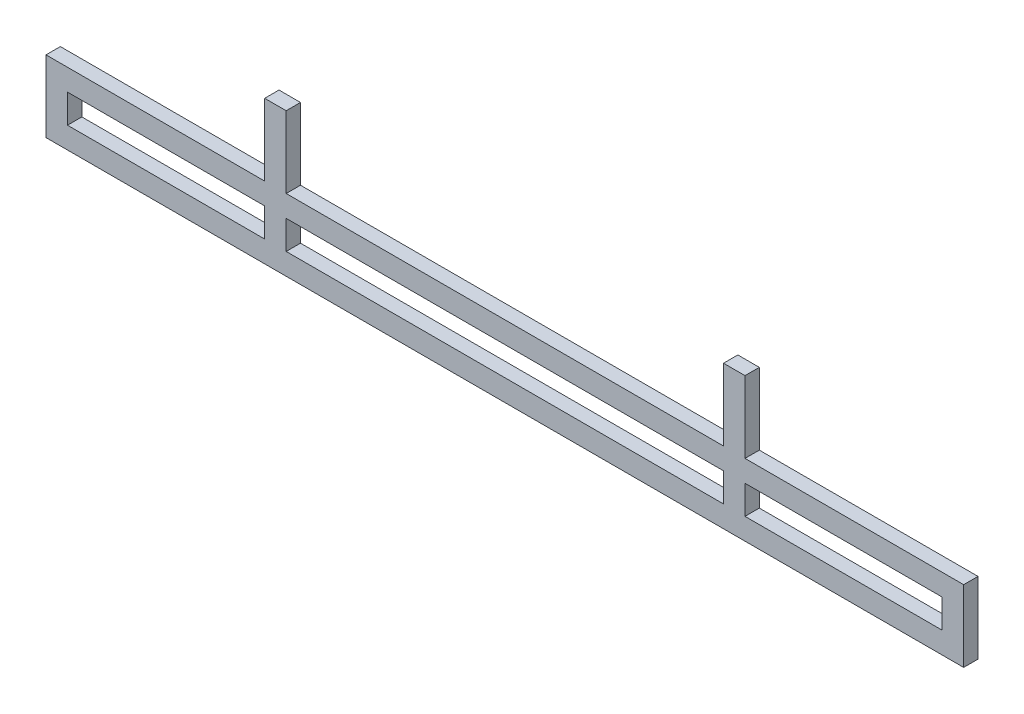
ISO-10303-21;
HEADER;
FILE_DESCRIPTION(('STEP AP214'),'2;1');
FILE_NAME('part.step','',(''),(''),'','','');
FILE_SCHEMA(('AUTOMOTIVE_DESIGN { 1 0 10303 214 1 1 1 1 }'));
ENDSEC;
DATA;
#1=APPLICATION_CONTEXT('core data for automotive mechanical design processes');
#2=APPLICATION_PROTOCOL_DEFINITION('international standard','automotive_design',2000,#1);
#3=PRODUCT_CONTEXT('',#1,'mechanical');
#4=PRODUCT('Part','Part','',(#3));
#5=PRODUCT_RELATED_PRODUCT_CATEGORY('part','',(#4));
#6=PRODUCT_DEFINITION_FORMATION('','',#4);
#7=PRODUCT_DEFINITION_CONTEXT('part definition',#1,'design');
#8=PRODUCT_DEFINITION('design','',#6,#7);
#9=PRODUCT_DEFINITION_SHAPE('','',#8);
#10=(LENGTH_UNIT() NAMED_UNIT(*) SI_UNIT(.MILLI.,.METRE.));
#11=(NAMED_UNIT(*) PLANE_ANGLE_UNIT() SI_UNIT($,.RADIAN.));
#12=(NAMED_UNIT(*) SI_UNIT($,.STERADIAN.) SOLID_ANGLE_UNIT());
#13=UNCERTAINTY_MEASURE_WITH_UNIT(LENGTH_MEASURE(1.E-05),#10,'distance_accuracy_value','');
#14=(GEOMETRIC_REPRESENTATION_CONTEXT(3) GLOBAL_UNCERTAINTY_ASSIGNED_CONTEXT((#13)) GLOBAL_UNIT_ASSIGNED_CONTEXT((#10,
#11,#12)) REPRESENTATION_CONTEXT('',''));
#15=CARTESIAN_POINT('',(0.,0.,0.));
#16=DIRECTION('',(0.,0.,1.));
#17=DIRECTION('',(1.,0.,0.));
#18=AXIS2_PLACEMENT_3D('',#15,#16,#17);
#19=CARTESIAN_POINT('',(-625.,-130.36,10.));
#20=DIRECTION('',(0.,1.,0.));
#21=DIRECTION('',(-1.,0.,0.));
#22=AXIS2_PLACEMENT_3D('',#19,#20,#21);
#23=PLANE('',#22);
#24=DIRECTION('',(0.,0.,1.));
#25=VECTOR('',#24,1.);
#26=CARTESIAN_POINT('',(-152.5,-130.36,0.));
#27=LINE('',#26,#25);
#28=CARTESIAN_POINT('',(-152.5,-130.36,0.));
#29=VERTEX_POINT('',#28);
#30=CARTESIAN_POINT('',(-152.5,-130.36,10.));
#31=VERTEX_POINT('',#30);
#32=EDGE_CURVE('E217',#29,#31,#27,.T.);
#33=ORIENTED_EDGE('',*,*,#32,.T.);
#34=DIRECTION('',(1.,0.,0.));
#35=VECTOR('',#34,1.);
#36=CARTESIAN_POINT('',(-625.,-130.36,10.));
#37=LINE('',#36,#35);
#38=CARTESIAN_POINT('',(-15.,-130.36,10.));
#39=VERTEX_POINT('',#38);
#40=EDGE_CURVE('E258',#31,#39,#37,.T.);
#41=ORIENTED_EDGE('',*,*,#40,.T.);
#42=DIRECTION('',(0.,0.,-1.));
#43=VECTOR('',#42,1.);
#44=CARTESIAN_POINT('',(-15.,-130.36,10.));
#45=LINE('',#44,#43);
#46=CARTESIAN_POINT('',(-15.,-130.36,0.));
#47=VERTEX_POINT('',#46);
#48=EDGE_CURVE('E283',#39,#47,#45,.T.);
#49=ORIENTED_EDGE('',*,*,#48,.T.);
#50=DIRECTION('',(1.,0.,0.));
#51=VECTOR('',#50,1.);
#52=CARTESIAN_POINT('',(-625.,-130.36,0.));
#53=LINE('',#52,#51);
#54=EDGE_CURVE('E245',#29,#47,#53,.T.);
#55=ORIENTED_EDGE('',*,*,#54,.F.);
#56=EDGE_LOOP('',(#33,#41,#49,#55));
#57=FACE_BOUND('',#56,.T.);
#58=ADVANCED_FACE('F35',(#57),#23,.T.);
#59=CARTESIAN_POINT('',(-625.,-110.36,10.));
#60=DIRECTION('',(0.,1.,0.));
#61=DIRECTION('',(-1.,0.,0.));
#62=AXIS2_PLACEMENT_3D('',#59,#60,#61);
#63=PLANE('',#62);
#64=DIRECTION('',(1.,0.,0.));
#65=VECTOR('',#64,1.);
#66=CARTESIAN_POINT('',(-625.,-110.36,10.));
#67=LINE('',#66,#65);
#68=CARTESIAN_POINT('',(-152.5,-110.36,10.));
#69=VERTEX_POINT('',#68);
#70=CARTESIAN_POINT('',(-15.,-110.36,10.));
#71=VERTEX_POINT('',#70);
#72=EDGE_CURVE('E50',#69,#71,#67,.T.);
#73=ORIENTED_EDGE('',*,*,#72,.F.);
#74=DIRECTION('',(0.,0.,1.));
#75=VECTOR('',#74,1.);
#76=CARTESIAN_POINT('',(-152.5,-110.36,0.));
#77=LINE('',#76,#75);
#78=CARTESIAN_POINT('',(-152.5,-110.36,0.));
#79=VERTEX_POINT('',#78);
#80=EDGE_CURVE('E209',#79,#69,#77,.T.);
#81=ORIENTED_EDGE('',*,*,#80,.F.);
#82=DIRECTION('',(1.,0.,0.));
#83=VECTOR('',#82,1.);
#84=CARTESIAN_POINT('',(-625.,-110.36,0.));
#85=LINE('',#84,#83);
#86=CARTESIAN_POINT('',(-15.,-110.36,0.));
#87=VERTEX_POINT('',#86);
#88=EDGE_CURVE('E197',#79,#87,#85,.T.);
#89=ORIENTED_EDGE('',*,*,#88,.T.);
#90=DIRECTION('',(0.,0.,-1.));
#91=VECTOR('',#90,1.);
#92=CARTESIAN_POINT('',(-15.,-110.36,10.));
#93=LINE('',#92,#91);
#94=EDGE_CURVE('E281',#71,#87,#93,.T.);
#95=ORIENTED_EDGE('',*,*,#94,.F.);
#96=EDGE_LOOP('',(#73,#81,#89,#95));
#97=FACE_BOUND('',#96,.T.);
#98=ADVANCED_FACE('F210',(#97),#63,.F.);
#99=DIRECTION('',(0.,0.,1.));
#100=VECTOR('',#99,1.);
#101=CARTESIAN_POINT('',(-167.5,-130.36,0.));
#102=LINE('',#101,#100);
#103=CARTESIAN_POINT('',(-167.5,-130.36,0.));
#104=VERTEX_POINT('',#103);
#105=CARTESIAN_POINT('',(-167.5,-130.36,10.));
#106=VERTEX_POINT('',#105);
#107=EDGE_CURVE('E229',#104,#106,#102,.T.);
#108=ORIENTED_EDGE('',*,*,#107,.F.);
#109=CARTESIAN_POINT('',(-472.5,-130.36,0.));
#110=VERTEX_POINT('',#109);
#111=EDGE_CURVE('E271',#110,#104,#53,.T.);
#112=ORIENTED_EDGE('',*,*,#111,.F.);
#113=DIRECTION('',(0.,0.,1.));
#114=VECTOR('',#113,1.);
#115=CARTESIAN_POINT('',(-472.5,-130.36,0.));
#116=LINE('',#115,#114);
#117=CARTESIAN_POINT('',(-472.5,-130.36,10.));
#118=VERTEX_POINT('',#117);
#119=EDGE_CURVE('E242',#110,#118,#116,.T.);
#120=ORIENTED_EDGE('',*,*,#119,.T.);
#121=EDGE_CURVE('E257',#118,#106,#37,.T.);
#122=ORIENTED_EDGE('',*,*,#121,.T.);
#123=EDGE_LOOP('',(#108,#112,#120,#122));
#124=FACE_BOUND('',#123,.T.);
#125=ADVANCED_FACE('F434',(#124),#23,.T.);
#126=CARTESIAN_POINT('',(-472.5,-110.36,0.));
#127=VERTEX_POINT('',#126);
#128=CARTESIAN_POINT('',(-167.5,-110.36,0.));
#129=VERTEX_POINT('',#128);
#130=EDGE_CURVE('E206',#127,#129,#85,.T.);
#131=ORIENTED_EDGE('',*,*,#130,.T.);
#132=DIRECTION('',(0.,0.,1.));
#133=VECTOR('',#132,1.);
#134=CARTESIAN_POINT('',(-167.5,-110.36,0.));
#135=LINE('',#134,#133);
#136=CARTESIAN_POINT('',(-167.5,-110.36,10.));
#137=VERTEX_POINT('',#136);
#138=EDGE_CURVE('E58',#129,#137,#135,.T.);
#139=ORIENTED_EDGE('',*,*,#138,.T.);
#140=CARTESIAN_POINT('',(-472.5,-110.36,10.));
#141=VERTEX_POINT('',#140);
#142=EDGE_CURVE('E265',#141,#137,#67,.T.);
#143=ORIENTED_EDGE('',*,*,#142,.F.);
#144=DIRECTION('',(0.,0.,1.));
#145=VECTOR('',#144,1.);
#146=CARTESIAN_POINT('',(-472.5,-110.36,0.));
#147=LINE('',#146,#145);
#148=EDGE_CURVE('E238',#127,#141,#147,.T.);
#149=ORIENTED_EDGE('',*,*,#148,.F.);
#150=EDGE_LOOP('',(#131,#139,#143,#149));
#151=FACE_BOUND('',#150,.T.);
#152=ADVANCED_FACE('F441',(#151),#63,.F.);
#153=CARTESIAN_POINT('',(0.,0.,10.));
#154=DIRECTION('',(0.,0.,1.));
#155=DIRECTION('',(1.,0.,0.));
#156=AXIS2_PLACEMENT_3D('',#153,#154,#155);
#157=PLANE('',#156);
#158=ORIENTED_EDGE('',*,*,#40,.F.);
#159=DIRECTION('',(0.,1.,0.));
#160=VECTOR('',#159,1.);
#161=CARTESIAN_POINT('',(-152.5,-110.36,10.));
#162=LINE('',#161,#160);
#163=EDGE_CURVE('E223',#31,#69,#162,.T.);
#164=ORIENTED_EDGE('',*,*,#163,.T.);
#165=ORIENTED_EDGE('',*,*,#72,.T.);
#166=DIRECTION('',(0.,-1.,0.));
#167=VECTOR('',#166,1.);
#168=CARTESIAN_POINT('',(-15.,-110.36,10.));
#169=LINE('',#168,#167);
#170=EDGE_CURVE('E256',#71,#39,#169,.T.);
#171=ORIENTED_EDGE('',*,*,#170,.T.);
#172=EDGE_LOOP('',(#158,#164,#165,#171));
#173=FACE_BOUND('',#172,.T.);
#174=ORIENTED_EDGE('',*,*,#121,.F.);
#175=DIRECTION('',(0.,1.,0.));
#176=VECTOR('',#175,1.);
#177=CARTESIAN_POINT('',(-472.5,-110.36,10.));
#178=LINE('',#177,#176);
#179=EDGE_CURVE('E228',#118,#141,#178,.T.);
#180=ORIENTED_EDGE('',*,*,#179,.T.);
#181=ORIENTED_EDGE('',*,*,#142,.T.);
#182=DIRECTION('',(0.,-1.,0.));
#183=VECTOR('',#182,1.);
#184=CARTESIAN_POINT('',(-167.5,-110.36,10.));
#185=LINE('',#184,#183);
#186=EDGE_CURVE('E219',#137,#106,#185,.T.);
#187=ORIENTED_EDGE('',*,*,#186,.T.);
#188=EDGE_LOOP('',(#174,#180,#181,#187));
#189=FACE_BOUND('',#188,.T.);
#190=DIRECTION('',(0.,1.,0.));
#191=VECTOR('',#190,1.);
#192=CARTESIAN_POINT('',(0.,-145.36,10.));
#193=LINE('',#192,#191);
#194=CARTESIAN_POINT('',(0.,-145.36,10.));
#195=VERTEX_POINT('',#194);
#196=CARTESIAN_POINT('',(0.,-95.3599999999997,10.));
#197=VERTEX_POINT('',#196);
#198=EDGE_CURVE('E339',#195,#197,#193,.T.);
#199=ORIENTED_EDGE('',*,*,#198,.T.);
#200=DIRECTION('',(-1.,0.,0.));
#201=VECTOR('',#200,1.);
#202=CARTESIAN_POINT('',(0.,-95.3599999999997,10.));
#203=LINE('',#202,#201);
#204=CARTESIAN_POINT('',(-152.5,-95.3599999999997,10.));
#205=VERTEX_POINT('',#204);
#206=EDGE_CURVE('E344',#197,#205,#203,.T.);
#207=ORIENTED_EDGE('',*,*,#206,.T.);
#208=DIRECTION('',(0.,1.,0.));
#209=VECTOR('',#208,1.);
#210=CARTESIAN_POINT('',(-152.5,0.,10.));
#211=LINE('',#210,#209);
#212=CARTESIAN_POINT('',(-152.5,-45.3599999999996,10.));
#213=VERTEX_POINT('',#212);
#214=EDGE_CURVE('E316',#205,#213,#211,.T.);
#215=ORIENTED_EDGE('',*,*,#214,.T.);
#216=DIRECTION('',(-1.,0.,0.));
#217=VECTOR('',#216,1.);
#218=CARTESIAN_POINT('',(0.,-45.3599999999996,10.));
#219=LINE('',#218,#217);
#220=CARTESIAN_POINT('',(-167.5,-45.3599999999996,10.));
#221=VERTEX_POINT('',#220);
#222=EDGE_CURVE('E314',#213,#221,#219,.T.);
#223=ORIENTED_EDGE('',*,*,#222,.T.);
#224=DIRECTION('',(0.,1.,0.));
#225=VECTOR('',#224,1.);
#226=CARTESIAN_POINT('',(-167.5,0.,10.));
#227=LINE('',#226,#225);
#228=CARTESIAN_POINT('',(-167.5,-95.3599999999997,10.));
#229=VERTEX_POINT('',#228);
#230=EDGE_CURVE('E319',#229,#221,#227,.T.);
#231=ORIENTED_EDGE('',*,*,#230,.F.);
#232=CARTESIAN_POINT('',(-472.5,-95.3599999999997,10.));
#233=VERTEX_POINT('',#232);
#234=EDGE_CURVE('E348',#229,#233,#203,.T.);
#235=ORIENTED_EDGE('',*,*,#234,.T.);
#236=DIRECTION('',(0.,1.,0.));
#237=VECTOR('',#236,1.);
#238=CARTESIAN_POINT('',(-472.5,-95.3599999999997,10.));
#239=LINE('',#238,#237);
#240=CARTESIAN_POINT('',(-472.5,-45.3599999999996,10.));
#241=VERTEX_POINT('',#240);
#242=EDGE_CURVE('E310',#233,#241,#239,.T.);
#243=ORIENTED_EDGE('',*,*,#242,.T.);
#244=DIRECTION('',(1.,0.,0.));
#245=VECTOR('',#244,1.);
#246=CARTESIAN_POINT('',(-487.5,-45.3599999999996,10.));
#247=LINE('',#246,#245);
#248=CARTESIAN_POINT('',(-487.5,-45.3599999999996,10.));
#249=VERTEX_POINT('',#248);
#250=EDGE_CURVE('E301',#249,#241,#247,.T.);
#251=ORIENTED_EDGE('',*,*,#250,.F.);
#252=DIRECTION('',(0.,1.,0.));
#253=VECTOR('',#252,1.);
#254=CARTESIAN_POINT('',(-487.5,-95.3599999999997,10.));
#255=LINE('',#254,#253);
#256=CARTESIAN_POINT('',(-487.5,-95.3599999999997,10.));
#257=VERTEX_POINT('',#256);
#258=EDGE_CURVE('E289',#257,#249,#255,.T.);
#259=ORIENTED_EDGE('',*,*,#258,.F.);
#260=CARTESIAN_POINT('',(-640.,-95.3599999999997,10.));
#261=VERTEX_POINT('',#260);
#262=EDGE_CURVE('E342',#257,#261,#203,.T.);
#263=ORIENTED_EDGE('',*,*,#262,.T.);
#264=DIRECTION('',(0.,-1.,0.));
#265=VECTOR('',#264,1.);
#266=CARTESIAN_POINT('',(-640.,-145.36,10.));
#267=LINE('',#266,#265);
#268=CARTESIAN_POINT('',(-640.,-145.36,10.));
#269=VERTEX_POINT('',#268);
#270=EDGE_CURVE('E347',#261,#269,#267,.T.);
#271=ORIENTED_EDGE('',*,*,#270,.T.);
#272=DIRECTION('',(1.,0.,0.));
#273=VECTOR('',#272,1.);
#274=CARTESIAN_POINT('',(0.,-145.36,10.));
#275=LINE('',#274,#273);
#276=EDGE_CURVE('E350',#269,#195,#275,.T.);
#277=ORIENTED_EDGE('',*,*,#276,.T.);
#278=EDGE_LOOP('',(#199,#207,#215,#223,#231,#235,#243,#251,#259,#263,#271,#277));
#279=FACE_BOUND('',#278,.T.);
#280=DIRECTION('',(0.,-1.,0.));
#281=VECTOR('',#280,1.);
#282=CARTESIAN_POINT('',(-487.5,-110.36,10.));
#283=LINE('',#282,#281);
#284=CARTESIAN_POINT('',(-487.5,-110.36,10.));
#285=VERTEX_POINT('',#284);
#286=CARTESIAN_POINT('',(-487.5,-130.36,10.));
#287=VERTEX_POINT('',#286);
#288=EDGE_CURVE('E235',#285,#287,#283,.T.);
#289=ORIENTED_EDGE('',*,*,#288,.T.);
#290=CARTESIAN_POINT('',(-625.,-130.36,10.));
#291=VERTEX_POINT('',#290);
#292=EDGE_CURVE('E254',#291,#287,#37,.T.);
#293=ORIENTED_EDGE('',*,*,#292,.F.);
#294=DIRECTION('',(0.,-1.,0.));
#295=VECTOR('',#294,1.);
#296=CARTESIAN_POINT('',(-625.,-110.36,10.));
#297=LINE('',#296,#295);
#298=CARTESIAN_POINT('',(-625.,-110.36,10.));
#299=VERTEX_POINT('',#298);
#300=EDGE_CURVE('E264',#299,#291,#297,.T.);
#301=ORIENTED_EDGE('',*,*,#300,.F.);
#302=EDGE_CURVE('E261',#299,#285,#67,.T.);
#303=ORIENTED_EDGE('',*,*,#302,.T.);
#304=EDGE_LOOP('',(#289,#293,#301,#303));
#305=FACE_BOUND('',#304,.T.);
#306=ADVANCED_FACE('F387',(#173,#189,#279,#305),#157,.T.);
#307=CARTESIAN_POINT('',(0.,0.,0.));
#308=DIRECTION('',(0.,0.,1.));
#309=DIRECTION('',(1.,0.,0.));
#310=AXIS2_PLACEMENT_3D('',#307,#308,#309);
#311=PLANE('',#310);
#312=DIRECTION('',(0.,1.,0.));
#313=VECTOR('',#312,1.);
#314=CARTESIAN_POINT('',(-152.5,-110.36,0.));
#315=LINE('',#314,#313);
#316=EDGE_CURVE('E201',#29,#79,#315,.T.);
#317=ORIENTED_EDGE('',*,*,#316,.F.);
#318=ORIENTED_EDGE('',*,*,#54,.T.);
#319=DIRECTION('',(0.,-1.,0.));
#320=VECTOR('',#319,1.);
#321=CARTESIAN_POINT('',(-15.,-110.36,0.));
#322=LINE('',#321,#320);
#323=EDGE_CURVE('E204',#87,#47,#322,.T.);
#324=ORIENTED_EDGE('',*,*,#323,.F.);
#325=ORIENTED_EDGE('',*,*,#88,.F.);
#326=EDGE_LOOP('',(#317,#318,#324,#325));
#327=FACE_BOUND('',#326,.T.);
#328=DIRECTION('',(0.,1.,0.));
#329=VECTOR('',#328,1.);
#330=CARTESIAN_POINT('',(-472.5,-110.36,0.));
#331=LINE('',#330,#329);
#332=EDGE_CURVE('E232',#110,#127,#331,.T.);
#333=ORIENTED_EDGE('',*,*,#332,.F.);
#334=ORIENTED_EDGE('',*,*,#111,.T.);
#335=DIRECTION('',(0.,-1.,0.));
#336=VECTOR('',#335,1.);
#337=CARTESIAN_POINT('',(-167.5,-110.36,0.));
#338=LINE('',#337,#336);
#339=EDGE_CURVE('E213',#129,#104,#338,.T.);
#340=ORIENTED_EDGE('',*,*,#339,.F.);
#341=ORIENTED_EDGE('',*,*,#130,.F.);
#342=EDGE_LOOP('',(#333,#334,#340,#341));
#343=FACE_BOUND('',#342,.T.);
#344=DIRECTION('',(0.,1.,0.));
#345=VECTOR('',#344,1.);
#346=CARTESIAN_POINT('',(0.,-145.36,0.));
#347=LINE('',#346,#345);
#348=CARTESIAN_POINT('',(0.,-145.36,0.));
#349=VERTEX_POINT('',#348);
#350=CARTESIAN_POINT('',(0.,-95.3599999999997,0.));
#351=VERTEX_POINT('',#350);
#352=EDGE_CURVE('E331',#349,#351,#347,.T.);
#353=ORIENTED_EDGE('',*,*,#352,.F.);
#354=DIRECTION('',(1.,0.,0.));
#355=VECTOR('',#354,1.);
#356=CARTESIAN_POINT('',(0.,-145.36,0.));
#357=LINE('',#356,#355);
#358=CARTESIAN_POINT('',(-640.,-145.36,0.));
#359=VERTEX_POINT('',#358);
#360=EDGE_CURVE('E343',#359,#349,#357,.T.);
#361=ORIENTED_EDGE('',*,*,#360,.F.);
#362=DIRECTION('',(0.,-1.,0.));
#363=VECTOR('',#362,1.);
#364=CARTESIAN_POINT('',(-640.,-145.36,0.));
#365=LINE('',#364,#363);
#366=CARTESIAN_POINT('',(-640.,-95.3599999999997,0.));
#367=VERTEX_POINT('',#366);
#368=EDGE_CURVE('E359',#367,#359,#365,.T.);
#369=ORIENTED_EDGE('',*,*,#368,.F.);
#370=DIRECTION('',(-1.,0.,0.));
#371=VECTOR('',#370,1.);
#372=CARTESIAN_POINT('',(0.,-95.3599999999997,0.));
#373=LINE('',#372,#371);
#374=CARTESIAN_POINT('',(-487.5,-95.3599999999997,0.));
#375=VERTEX_POINT('',#374);
#376=EDGE_CURVE('E355',#375,#367,#373,.T.);
#377=ORIENTED_EDGE('',*,*,#376,.F.);
#378=DIRECTION('',(0.,1.,0.));
#379=VECTOR('',#378,1.);
#380=CARTESIAN_POINT('',(-487.5,-95.3599999999997,0.));
#381=LINE('',#380,#379);
#382=CARTESIAN_POINT('',(-487.5,-45.3599999999996,0.));
#383=VERTEX_POINT('',#382);
#384=EDGE_CURVE('E297',#375,#383,#381,.T.);
#385=ORIENTED_EDGE('',*,*,#384,.T.);
#386=DIRECTION('',(1.,0.,0.));
#387=VECTOR('',#386,1.);
#388=CARTESIAN_POINT('',(-487.5,-45.3599999999996,0.));
#389=LINE('',#388,#387);
#390=CARTESIAN_POINT('',(-472.5,-45.3599999999996,0.));
#391=VERTEX_POINT('',#390);
#392=EDGE_CURVE('E304',#383,#391,#389,.T.);
#393=ORIENTED_EDGE('',*,*,#392,.T.);
#394=DIRECTION('',(0.,1.,0.));
#395=VECTOR('',#394,1.);
#396=CARTESIAN_POINT('',(-472.5,-95.3599999999997,0.));
#397=LINE('',#396,#395);
#398=CARTESIAN_POINT('',(-472.5,-95.3599999999997,0.));
#399=VERTEX_POINT('',#398);
#400=EDGE_CURVE('E300',#399,#391,#397,.T.);
#401=ORIENTED_EDGE('',*,*,#400,.F.);
#402=CARTESIAN_POINT('',(-167.5,-95.3599999999997,0.));
#403=VERTEX_POINT('',#402);
#404=EDGE_CURVE('E360',#403,#399,#373,.T.);
#405=ORIENTED_EDGE('',*,*,#404,.F.);
#406=DIRECTION('',(0.,1.,0.));
#407=VECTOR('',#406,1.);
#408=CARTESIAN_POINT('',(-167.5,0.,0.));
#409=LINE('',#408,#407);
#410=CARTESIAN_POINT('',(-167.5,-45.3599999999996,0.));
#411=VERTEX_POINT('',#410);
#412=EDGE_CURVE('E317',#403,#411,#409,.T.);
#413=ORIENTED_EDGE('',*,*,#412,.T.);
#414=DIRECTION('',(-1.,0.,0.));
#415=VECTOR('',#414,1.);
#416=CARTESIAN_POINT('',(0.,-45.3599999999996,0.));
#417=LINE('',#416,#415);
#418=CARTESIAN_POINT('',(-152.5,-45.3599999999996,0.));
#419=VERTEX_POINT('',#418);
#420=EDGE_CURVE('E307',#419,#411,#417,.T.);
#421=ORIENTED_EDGE('',*,*,#420,.F.);
#422=DIRECTION('',(0.,1.,0.));
#423=VECTOR('',#422,1.);
#424=CARTESIAN_POINT('',(-152.5,0.,0.));
#425=LINE('',#424,#423);
#426=CARTESIAN_POINT('',(-152.5,-95.3599999999997,0.));
#427=VERTEX_POINT('',#426);
#428=EDGE_CURVE('E325',#427,#419,#425,.T.);
#429=ORIENTED_EDGE('',*,*,#428,.F.);
#430=EDGE_CURVE('E356',#351,#427,#373,.T.);
#431=ORIENTED_EDGE('',*,*,#430,.F.);
#432=EDGE_LOOP('',(#353,#361,#369,#377,#385,#393,#401,#405,#413,#421,#429,#431));
#433=FACE_BOUND('',#432,.T.);
#434=CARTESIAN_POINT('',(-625.,-130.36,0.));
#435=VERTEX_POINT('',#434);
#436=CARTESIAN_POINT('',(-487.5,-130.36,0.));
#437=VERTEX_POINT('',#436);
#438=EDGE_CURVE('E268',#435,#437,#53,.T.);
#439=ORIENTED_EDGE('',*,*,#438,.T.);
#440=DIRECTION('',(0.,-1.,0.));
#441=VECTOR('',#440,1.);
#442=CARTESIAN_POINT('',(-487.5,-110.36,0.));
#443=LINE('',#442,#441);
#444=CARTESIAN_POINT('',(-487.5,-110.36,0.));
#445=VERTEX_POINT('',#444);
#446=EDGE_CURVE('E234',#445,#437,#443,.T.);
#447=ORIENTED_EDGE('',*,*,#446,.F.);
#448=CARTESIAN_POINT('',(-625.,-110.36,0.));
#449=VERTEX_POINT('',#448);
#450=EDGE_CURVE('E208',#449,#445,#85,.T.);
#451=ORIENTED_EDGE('',*,*,#450,.F.);
#452=DIRECTION('',(0.,-1.,0.));
#453=VECTOR('',#452,1.);
#454=CARTESIAN_POINT('',(-625.,-110.36,0.));
#455=LINE('',#454,#453);
#456=EDGE_CURVE('E274',#449,#435,#455,.T.);
#457=ORIENTED_EDGE('',*,*,#456,.T.);
#458=EDGE_LOOP('',(#439,#447,#451,#457));
#459=FACE_BOUND('',#458,.T.);
#460=ADVANCED_FACE('F198',(#327,#343,#433,#459),#311,.F.);
#461=CARTESIAN_POINT('',(0.,-95.3599999999997,10.));
#462=DIRECTION('',(0.,-1.,0.));
#463=DIRECTION('',(1.,0.,0.));
#464=AXIS2_PLACEMENT_3D('',#461,#462,#463);
#465=PLANE('',#464);
#466=DIRECTION('',(0.,0.,-1.));
#467=VECTOR('',#466,1.);
#468=CARTESIAN_POINT('',(-472.5,-95.3599999999997,10.));
#469=LINE('',#468,#467);
#470=EDGE_CURVE('E290',#233,#399,#469,.T.);
#471=ORIENTED_EDGE('',*,*,#470,.F.);
#472=ORIENTED_EDGE('',*,*,#234,.F.);
#473=DIRECTION('',(0.,0.,-1.));
#474=VECTOR('',#473,1.);
#475=CARTESIAN_POINT('',(-167.5,-95.3599999999997,10.));
#476=LINE('',#475,#474);
#477=EDGE_CURVE('E332',#229,#403,#476,.T.);
#478=ORIENTED_EDGE('',*,*,#477,.T.);
#479=ORIENTED_EDGE('',*,*,#404,.T.);
#480=EDGE_LOOP('',(#471,#472,#478,#479));
#481=FACE_BOUND('',#480,.T.);
#482=ADVANCED_FACE('F409',(#481),#465,.F.);
#483=DIRECTION('',(0.,0.,-1.));
#484=VECTOR('',#483,1.);
#485=CARTESIAN_POINT('',(-152.5,-95.3599999999997,10.));
#486=LINE('',#485,#484);
#487=EDGE_CURVE('E335',#205,#427,#486,.T.);
#488=ORIENTED_EDGE('',*,*,#487,.F.);
#489=ORIENTED_EDGE('',*,*,#206,.F.);
#490=DIRECTION('',(0.,0.,-1.));
#491=VECTOR('',#490,1.);
#492=CARTESIAN_POINT('',(0.,-95.3599999999997,10.));
#493=LINE('',#492,#491);
#494=EDGE_CURVE('E11',#197,#351,#493,.T.);
#495=ORIENTED_EDGE('',*,*,#494,.T.);
#496=ORIENTED_EDGE('',*,*,#430,.T.);
#497=EDGE_LOOP('',(#488,#489,#495,#496));
#498=FACE_BOUND('',#497,.T.);
#499=ADVANCED_FACE('F423',(#498),#465,.F.);
#500=CARTESIAN_POINT('',(0.,-145.36,10.));
#501=DIRECTION('',(-1.,0.,0.));
#502=DIRECTION('',(0.,0.,1.));
#503=AXIS2_PLACEMENT_3D('',#500,#501,#502);
#504=PLANE('',#503);
#505=ORIENTED_EDGE('',*,*,#352,.T.);
#506=ORIENTED_EDGE('',*,*,#494,.F.);
#507=ORIENTED_EDGE('',*,*,#198,.F.);
#508=DIRECTION('',(0.,0.,-1.));
#509=VECTOR('',#508,1.);
#510=CARTESIAN_POINT('',(0.,-145.36,10.));
#511=LINE('',#510,#509);
#512=EDGE_CURVE('E352',#195,#349,#511,.T.);
#513=ORIENTED_EDGE('',*,*,#512,.T.);
#514=EDGE_LOOP('',(#505,#506,#507,#513));
#515=FACE_BOUND('',#514,.T.);
#516=ADVANCED_FACE('F37',(#515),#504,.F.);
#517=ORIENTED_EDGE('',*,*,#262,.F.);
#518=DIRECTION('',(0.,0.,-1.));
#519=VECTOR('',#518,1.);
#520=CARTESIAN_POINT('',(-487.5,-95.3599999999997,10.));
#521=LINE('',#520,#519);
#522=EDGE_CURVE('E293',#257,#375,#521,.T.);
#523=ORIENTED_EDGE('',*,*,#522,.T.);
#524=ORIENTED_EDGE('',*,*,#376,.T.);
#525=DIRECTION('',(0.,0.,-1.));
#526=VECTOR('',#525,1.);
#527=CARTESIAN_POINT('',(-640.,-95.3599999999997,10.));
#528=LINE('',#527,#526);
#529=EDGE_CURVE('E43',#261,#367,#528,.T.);
#530=ORIENTED_EDGE('',*,*,#529,.F.);
#531=EDGE_LOOP('',(#517,#523,#524,#530));
#532=FACE_BOUND('',#531,.T.);
#533=ADVANCED_FACE('F407',(#532),#465,.F.);
#534=CARTESIAN_POINT('',(-640.,-145.36,10.));
#535=DIRECTION('',(1.,0.,0.));
#536=DIRECTION('',(0.,0.,-1.));
#537=AXIS2_PLACEMENT_3D('',#534,#535,#536);
#538=PLANE('',#537);
#539=ORIENTED_EDGE('',*,*,#368,.T.);
#540=DIRECTION('',(0.,0.,-1.));
#541=VECTOR('',#540,1.);
#542=CARTESIAN_POINT('',(-640.,-145.36,10.));
#543=LINE('',#542,#541);
#544=EDGE_CURVE('E365',#269,#359,#543,.T.);
#545=ORIENTED_EDGE('',*,*,#544,.F.);
#546=ORIENTED_EDGE('',*,*,#270,.F.);
#547=ORIENTED_EDGE('',*,*,#529,.T.);
#548=EDGE_LOOP('',(#539,#545,#546,#547));
#549=FACE_BOUND('',#548,.T.);
#550=ADVANCED_FACE('F372',(#549),#538,.F.);
#551=CARTESIAN_POINT('',(0.,-145.36,10.));
#552=DIRECTION('',(0.,1.,0.));
#553=DIRECTION('',(-1.,0.,0.));
#554=AXIS2_PLACEMENT_3D('',#551,#552,#553);
#555=PLANE('',#554);
#556=ORIENTED_EDGE('',*,*,#360,.T.);
#557=ORIENTED_EDGE('',*,*,#512,.F.);
#558=ORIENTED_EDGE('',*,*,#276,.F.);
#559=ORIENTED_EDGE('',*,*,#544,.T.);
#560=EDGE_LOOP('',(#556,#557,#558,#559));
#561=FACE_BOUND('',#560,.T.);
#562=ADVANCED_FACE('F381',(#561),#555,.F.);
#563=CARTESIAN_POINT('',(0.,-45.3599999999996,10.));
#564=DIRECTION('',(0.,-1.,0.));
#565=DIRECTION('',(0.,0.,-1.));
#566=AXIS2_PLACEMENT_3D('',#563,#564,#565);
#567=PLANE('',#566);
#568=ORIENTED_EDGE('',*,*,#420,.T.);
#569=DIRECTION('',(0.,0.,-1.));
#570=VECTOR('',#569,1.);
#571=CARTESIAN_POINT('',(-167.5,-45.3599999999996,10.));
#572=LINE('',#571,#570);
#573=EDGE_CURVE('E329',#221,#411,#572,.T.);
#574=ORIENTED_EDGE('',*,*,#573,.F.);
#575=ORIENTED_EDGE('',*,*,#222,.F.);
#576=DIRECTION('',(0.,0.,-1.));
#577=VECTOR('',#576,1.);
#578=CARTESIAN_POINT('',(-152.5,-45.3599999999996,10.));
#579=LINE('',#578,#577);
#580=EDGE_CURVE('E322',#213,#419,#579,.T.);
#581=ORIENTED_EDGE('',*,*,#580,.T.);
#582=EDGE_LOOP('',(#568,#574,#575,#581));
#583=FACE_BOUND('',#582,.T.);
#584=ADVANCED_FACE('F417',(#583),#567,.F.);
#585=CARTESIAN_POINT('',(-167.5,0.,10.));
#586=DIRECTION('',(-1.,0.,0.));
#587=DIRECTION('',(0.,0.,1.));
#588=AXIS2_PLACEMENT_3D('',#585,#586,#587);
#589=PLANE('',#588);
#590=ORIENTED_EDGE('',*,*,#412,.F.);
#591=ORIENTED_EDGE('',*,*,#477,.F.);
#592=ORIENTED_EDGE('',*,*,#230,.T.);
#593=ORIENTED_EDGE('',*,*,#573,.T.);
#594=EDGE_LOOP('',(#590,#591,#592,#593));
#595=FACE_BOUND('',#594,.T.);
#596=ADVANCED_FACE('F413',(#595),#589,.T.);
#597=CARTESIAN_POINT('',(-152.5,0.,10.));
#598=DIRECTION('',(-1.,0.,0.));
#599=DIRECTION('',(0.,0.,1.));
#600=AXIS2_PLACEMENT_3D('',#597,#598,#599);
#601=PLANE('',#600);
#602=ORIENTED_EDGE('',*,*,#428,.T.);
#603=ORIENTED_EDGE('',*,*,#580,.F.);
#604=ORIENTED_EDGE('',*,*,#214,.F.);
#605=ORIENTED_EDGE('',*,*,#487,.T.);
#606=EDGE_LOOP('',(#602,#603,#604,#605));
#607=FACE_BOUND('',#606,.T.);
#608=ADVANCED_FACE('F420',(#607),#601,.F.);
#609=CARTESIAN_POINT('',(-487.5,-45.3599999999996,10.));
#610=DIRECTION('',(0.,1.,0.));
#611=DIRECTION('',(0.,0.,1.));
#612=AXIS2_PLACEMENT_3D('',#609,#610,#611);
#613=PLANE('',#612);
#614=ORIENTED_EDGE('',*,*,#392,.F.);
#615=DIRECTION('',(0.,0.,-1.));
#616=VECTOR('',#615,1.);
#617=CARTESIAN_POINT('',(-487.5,-45.3599999999996,10.));
#618=LINE('',#617,#616);
#619=EDGE_CURVE('E286',#249,#383,#618,.T.);
#620=ORIENTED_EDGE('',*,*,#619,.F.);
#621=ORIENTED_EDGE('',*,*,#250,.T.);
#622=DIRECTION('',(0.,0.,-1.));
#623=VECTOR('',#622,1.);
#624=CARTESIAN_POINT('',(-472.5,-45.3599999999996,10.));
#625=LINE('',#624,#623);
#626=EDGE_CURVE('E287',#241,#391,#625,.T.);
#627=ORIENTED_EDGE('',*,*,#626,.T.);
#628=EDGE_LOOP('',(#614,#620,#621,#627));
#629=FACE_BOUND('',#628,.T.);
#630=ADVANCED_FACE('F403',(#629),#613,.T.);
#631=CARTESIAN_POINT('',(-487.5,-95.3599999999997,10.));
#632=DIRECTION('',(-1.,0.,0.));
#633=DIRECTION('',(0.,0.,1.));
#634=AXIS2_PLACEMENT_3D('',#631,#632,#633);
#635=PLANE('',#634);
#636=ORIENTED_EDGE('',*,*,#384,.F.);
#637=ORIENTED_EDGE('',*,*,#522,.F.);
#638=ORIENTED_EDGE('',*,*,#258,.T.);
#639=ORIENTED_EDGE('',*,*,#619,.T.);
#640=EDGE_LOOP('',(#636,#637,#638,#639));
#641=FACE_BOUND('',#640,.T.);
#642=ADVANCED_FACE('F406',(#641),#635,.T.);
#643=CARTESIAN_POINT('',(-472.5,-95.3599999999997,10.));
#644=DIRECTION('',(-1.,0.,0.));
#645=DIRECTION('',(0.,0.,1.));
#646=AXIS2_PLACEMENT_3D('',#643,#644,#645);
#647=PLANE('',#646);
#648=ORIENTED_EDGE('',*,*,#400,.T.);
#649=ORIENTED_EDGE('',*,*,#626,.F.);
#650=ORIENTED_EDGE('',*,*,#242,.F.);
#651=ORIENTED_EDGE('',*,*,#470,.T.);
#652=EDGE_LOOP('',(#648,#649,#650,#651));
#653=FACE_BOUND('',#652,.T.);
#654=ADVANCED_FACE('F399',(#653),#647,.F.);
#655=DIRECTION('',(0.,0.,1.));
#656=VECTOR('',#655,1.);
#657=CARTESIAN_POINT('',(-487.5,-130.36,0.));
#658=LINE('',#657,#656);
#659=EDGE_CURVE('E246',#437,#287,#658,.T.);
#660=ORIENTED_EDGE('',*,*,#659,.F.);
#661=ORIENTED_EDGE('',*,*,#438,.F.);
#662=DIRECTION('',(0.,0.,-1.));
#663=VECTOR('',#662,1.);
#664=CARTESIAN_POINT('',(-625.,-130.36,10.));
#665=LINE('',#664,#663);
#666=EDGE_CURVE('E267',#291,#435,#665,.T.);
#667=ORIENTED_EDGE('',*,*,#666,.F.);
#668=ORIENTED_EDGE('',*,*,#292,.T.);
#669=EDGE_LOOP('',(#660,#661,#667,#668));
#670=FACE_BOUND('',#669,.T.);
#671=ADVANCED_FACE('F435',(#670),#23,.T.);
#672=CARTESIAN_POINT('',(-15.,-110.36,10.));
#673=DIRECTION('',(1.,0.,0.));
#674=DIRECTION('',(0.,1.,0.));
#675=AXIS2_PLACEMENT_3D('',#672,#673,#674);
#676=PLANE('',#675);
#677=ORIENTED_EDGE('',*,*,#323,.T.);
#678=ORIENTED_EDGE('',*,*,#48,.F.);
#679=ORIENTED_EDGE('',*,*,#170,.F.);
#680=ORIENTED_EDGE('',*,*,#94,.T.);
#681=EDGE_LOOP('',(#677,#678,#679,#680));
#682=FACE_BOUND('',#681,.T.);
#683=ADVANCED_FACE('F448',(#682),#676,.F.);
#684=ORIENTED_EDGE('',*,*,#450,.T.);
#685=DIRECTION('',(0.,0.,1.));
#686=VECTOR('',#685,1.);
#687=CARTESIAN_POINT('',(-487.5,-110.36,0.));
#688=LINE('',#687,#686);
#689=EDGE_CURVE('E249',#445,#285,#688,.T.);
#690=ORIENTED_EDGE('',*,*,#689,.T.);
#691=ORIENTED_EDGE('',*,*,#302,.F.);
#692=DIRECTION('',(0.,0.,-1.));
#693=VECTOR('',#692,1.);
#694=CARTESIAN_POINT('',(-625.,-110.36,10.));
#695=LINE('',#694,#693);
#696=EDGE_CURVE('E279',#299,#449,#695,.T.);
#697=ORIENTED_EDGE('',*,*,#696,.T.);
#698=EDGE_LOOP('',(#684,#690,#691,#697));
#699=FACE_BOUND('',#698,.T.);
#700=ADVANCED_FACE('F442',(#699),#63,.F.);
#701=CARTESIAN_POINT('',(-625.,-110.36,10.));
#702=DIRECTION('',(1.,0.,0.));
#703=DIRECTION('',(0.,0.,-1.));
#704=AXIS2_PLACEMENT_3D('',#701,#702,#703);
#705=PLANE('',#704);
#706=ORIENTED_EDGE('',*,*,#456,.F.);
#707=ORIENTED_EDGE('',*,*,#696,.F.);
#708=ORIENTED_EDGE('',*,*,#300,.T.);
#709=ORIENTED_EDGE('',*,*,#666,.T.);
#710=EDGE_LOOP('',(#706,#707,#708,#709));
#711=FACE_BOUND('',#710,.T.);
#712=ADVANCED_FACE('F469',(#711),#705,.T.);
#713=CARTESIAN_POINT('',(-472.5,-110.36,0.));
#714=DIRECTION('',(1.,0.,0.));
#715=DIRECTION('',(0.,0.,-1.));
#716=AXIS2_PLACEMENT_3D('',#713,#714,#715);
#717=PLANE('',#716);
#718=ORIENTED_EDGE('',*,*,#179,.F.);
#719=ORIENTED_EDGE('',*,*,#119,.F.);
#720=ORIENTED_EDGE('',*,*,#332,.T.);
#721=ORIENTED_EDGE('',*,*,#148,.T.);
#722=EDGE_LOOP('',(#718,#719,#720,#721));
#723=FACE_BOUND('',#722,.T.);
#724=ADVANCED_FACE('F471',(#723),#717,.T.);
#725=CARTESIAN_POINT('',(-487.5,-110.36,0.));
#726=DIRECTION('',(-1.,0.,0.));
#727=DIRECTION('',(0.,0.,1.));
#728=AXIS2_PLACEMENT_3D('',#725,#726,#727);
#729=PLANE('',#728);
#730=ORIENTED_EDGE('',*,*,#288,.F.);
#731=ORIENTED_EDGE('',*,*,#689,.F.);
#732=ORIENTED_EDGE('',*,*,#446,.T.);
#733=ORIENTED_EDGE('',*,*,#659,.T.);
#734=EDGE_LOOP('',(#730,#731,#732,#733));
#735=FACE_BOUND('',#734,.T.);
#736=ADVANCED_FACE('F464',(#735),#729,.T.);
#737=CARTESIAN_POINT('',(-152.5,-110.36,0.));
#738=DIRECTION('',(1.,0.,0.));
#739=DIRECTION('',(0.,0.,-1.));
#740=AXIS2_PLACEMENT_3D('',#737,#738,#739);
#741=PLANE('',#740);
#742=ORIENTED_EDGE('',*,*,#163,.F.);
#743=ORIENTED_EDGE('',*,*,#32,.F.);
#744=ORIENTED_EDGE('',*,*,#316,.T.);
#745=ORIENTED_EDGE('',*,*,#80,.T.);
#746=EDGE_LOOP('',(#742,#743,#744,#745));
#747=FACE_BOUND('',#746,.T.);
#748=ADVANCED_FACE('F215',(#747),#741,.T.);
#749=CARTESIAN_POINT('',(-167.5,-110.36,0.));
#750=DIRECTION('',(-1.,0.,0.));
#751=DIRECTION('',(0.,0.,1.));
#752=AXIS2_PLACEMENT_3D('',#749,#750,#751);
#753=PLANE('',#752);
#754=ORIENTED_EDGE('',*,*,#186,.F.);
#755=ORIENTED_EDGE('',*,*,#138,.F.);
#756=ORIENTED_EDGE('',*,*,#339,.T.);
#757=ORIENTED_EDGE('',*,*,#107,.T.);
#758=EDGE_LOOP('',(#754,#755,#756,#757));
#759=FACE_BOUND('',#758,.T.);
#760=ADVANCED_FACE('F484',(#759),#753,.T.);
#761=CLOSED_SHELL('',(#58,#98,#125,#152,#306,#460,#482,#499,#516,#533,#550,#562,#584,#596,#608,
#630,#642,#654,#671,#683,#700,#712,#724,#736,#748,#760));
#762=MANIFOLD_SOLID_BREP('B2',#761);
#763=ADVANCED_BREP_SHAPE_REPRESENTATION('',(#18,#762),#14);
#764=SHAPE_DEFINITION_REPRESENTATION(#9,#763);
ENDSEC;
END-ISO-10303-21;
